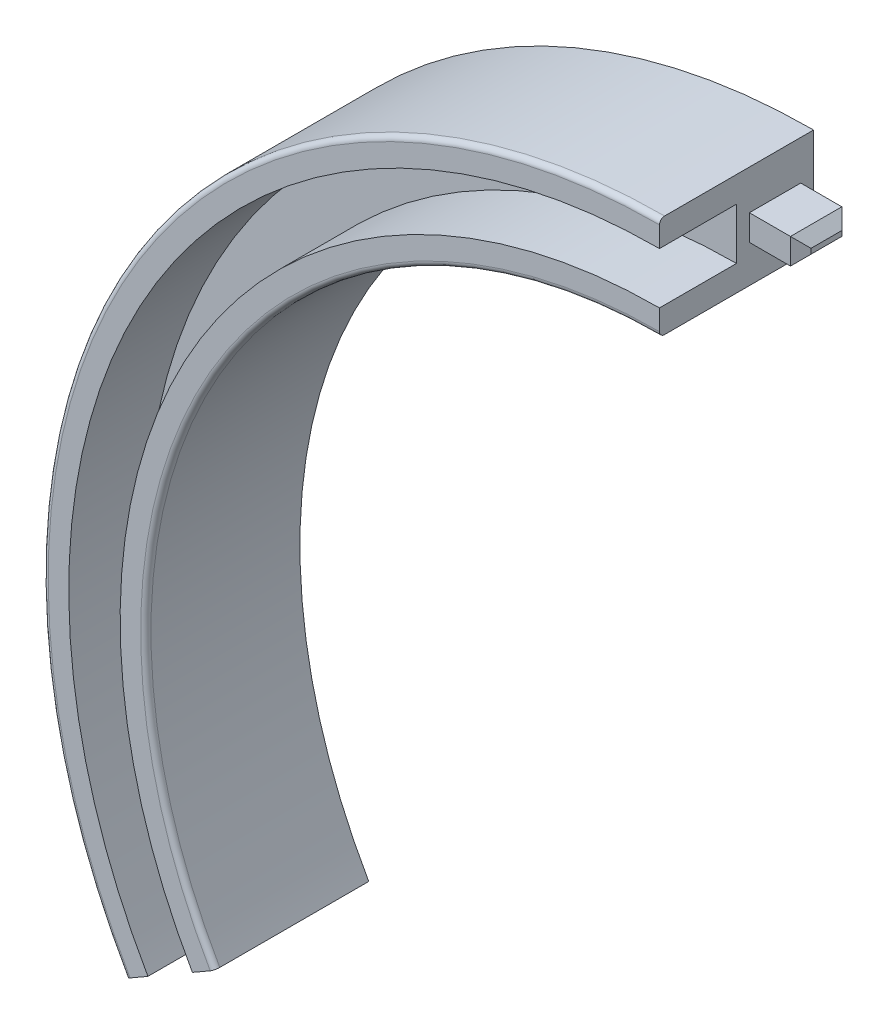
ISO-10303-21;
HEADER;
FILE_DESCRIPTION(('STEP AP214'),'2;1');
FILE_NAME('part.step','',(''),(''),'','','');
FILE_SCHEMA(('AUTOMOTIVE_DESIGN { 1 0 10303 214 1 1 1 1 }'));
ENDSEC;
DATA;
#1=APPLICATION_CONTEXT('core data for automotive mechanical design processes');
#2=APPLICATION_PROTOCOL_DEFINITION('international standard','automotive_design',2000,#1);
#3=PRODUCT_CONTEXT('',#1,'mechanical');
#4=PRODUCT('Part','Part','',(#3));
#5=PRODUCT_RELATED_PRODUCT_CATEGORY('part','',(#4));
#6=PRODUCT_DEFINITION_FORMATION('','',#4);
#7=PRODUCT_DEFINITION_CONTEXT('part definition',#1,'design');
#8=PRODUCT_DEFINITION('design','',#6,#7);
#9=PRODUCT_DEFINITION_SHAPE('','',#8);
#10=(LENGTH_UNIT() NAMED_UNIT(*) SI_UNIT(.MILLI.,.METRE.));
#11=(NAMED_UNIT(*) PLANE_ANGLE_UNIT() SI_UNIT($,.RADIAN.));
#12=(NAMED_UNIT(*) SI_UNIT($,.STERADIAN.) SOLID_ANGLE_UNIT());
#13=UNCERTAINTY_MEASURE_WITH_UNIT(LENGTH_MEASURE(1.E-05),#10,'distance_accuracy_value','');
#14=(GEOMETRIC_REPRESENTATION_CONTEXT(3) GLOBAL_UNCERTAINTY_ASSIGNED_CONTEXT((#13)) GLOBAL_UNIT_ASSIGNED_CONTEXT((#10,
#11,#12)) REPRESENTATION_CONTEXT('',''));
#15=CARTESIAN_POINT('',(0.,0.,0.));
#16=DIRECTION('',(0.,0.,1.));
#17=DIRECTION('',(1.,0.,0.));
#18=AXIS2_PLACEMENT_3D('',#15,#16,#17);
#19=CARTESIAN_POINT('',(0.,100.,30.));
#20=DIRECTION('',(-1.,0.,0.));
#21=DIRECTION('',(0.,0.,1.));
#22=AXIS2_PLACEMENT_3D('',#19,#20,#21);
#23=PLANE('',#22);
#24=DIRECTION('',(0.,0.,-1.));
#25=VECTOR('',#24,1.);
#26=CARTESIAN_POINT('',(0.,120.,30.));
#27=LINE('',#26,#25);
#28=CARTESIAN_POINT('',(0.,120.,29.));
#29=VERTEX_POINT('',#28);
#30=CARTESIAN_POINT('',(0.,120.,0.));
#31=VERTEX_POINT('',#30);
#32=EDGE_CURVE('E313',#29,#31,#27,.T.);
#33=ORIENTED_EDGE('',*,*,#32,.F.);
#34=CARTESIAN_POINT('',(0.,119.,29.));
#35=DIRECTION('',(-1.,0.,0.));
#36=DIRECTION('',(0.,0.,1.));
#37=AXIS2_PLACEMENT_3D('',#34,#35,#36);
#38=CIRCLE('',#37,1.);
#39=CARTESIAN_POINT('',(0.,119.,30.));
#40=VERTEX_POINT('',#39);
#41=EDGE_CURVE('E393',#29,#40,#38,.F.);
#42=ORIENTED_EDGE('',*,*,#41,.T.);
#43=DIRECTION('',(0.,1.,0.));
#44=VECTOR('',#43,1.);
#45=CARTESIAN_POINT('',(0.,100.,30.));
#46=LINE('',#45,#44);
#47=CARTESIAN_POINT('',(0.,115.,30.));
#48=VERTEX_POINT('',#47);
#49=EDGE_CURVE('E308',#48,#40,#46,.T.);
#50=ORIENTED_EDGE('',*,*,#49,.F.);
#51=DIRECTION('',(0.,0.,-1.));
#52=VECTOR('',#51,1.);
#53=CARTESIAN_POINT('',(0.,115.,340.50412084802));
#54=LINE('',#53,#52);
#55=CARTESIAN_POINT('',(0.,115.,15.));
#56=VERTEX_POINT('',#55);
#57=EDGE_CURVE('E296',#48,#56,#54,.T.);
#58=ORIENTED_EDGE('',*,*,#57,.T.);
#59=DIRECTION('',(0.,1.,0.));
#60=VECTOR('',#59,1.);
#61=CARTESIAN_POINT('',(0.,105.,15.));
#62=LINE('',#61,#60);
#63=CARTESIAN_POINT('',(0.,105.,15.));
#64=VERTEX_POINT('',#63);
#65=EDGE_CURVE('E277',#64,#56,#62,.T.);
#66=ORIENTED_EDGE('',*,*,#65,.F.);
#67=DIRECTION('',(0.,0.,-1.));
#68=VECTOR('',#67,1.);
#69=CARTESIAN_POINT('',(0.,105.,340.50412084802));
#70=LINE('',#69,#68);
#71=CARTESIAN_POINT('',(0.,105.,30.));
#72=VERTEX_POINT('',#71);
#73=EDGE_CURVE('E288',#72,#64,#70,.T.);
#74=ORIENTED_EDGE('',*,*,#73,.F.);
#75=CARTESIAN_POINT('',(0.,101.,30.));
#76=VERTEX_POINT('',#75);
#77=EDGE_CURVE('E310',#76,#72,#46,.T.);
#78=ORIENTED_EDGE('',*,*,#77,.F.);
#79=CARTESIAN_POINT('',(0.,101.,29.));
#80=DIRECTION('',(-1.,0.,0.));
#81=DIRECTION('',(0.,0.,1.));
#82=AXIS2_PLACEMENT_3D('',#79,#80,#81);
#83=CIRCLE('',#82,1.);
#84=CARTESIAN_POINT('',(0.,100.,29.));
#85=VERTEX_POINT('',#84);
#86=EDGE_CURVE('E61',#76,#85,#83,.F.);
#87=ORIENTED_EDGE('',*,*,#86,.T.);
#88=DIRECTION('',(0.,0.,-1.));
#89=VECTOR('',#88,1.);
#90=CARTESIAN_POINT('',(0.,100.,30.));
#91=LINE('',#90,#89);
#92=CARTESIAN_POINT('',(0.,100.,0.));
#93=VERTEX_POINT('',#92);
#94=EDGE_CURVE('E331',#85,#93,#91,.T.);
#95=ORIENTED_EDGE('',*,*,#94,.T.);
#96=DIRECTION('',(0.,1.,0.));
#97=VECTOR('',#96,1.);
#98=CARTESIAN_POINT('',(0.,100.,0.));
#99=LINE('',#98,#97);
#100=EDGE_CURVE('E325',#93,#31,#99,.T.);
#101=ORIENTED_EDGE('',*,*,#100,.T.);
#102=EDGE_LOOP('',(#33,#42,#50,#58,#66,#74,#78,#87,#95,#101));
#103=FACE_BOUND('',#102,.T.);
#104=DIRECTION('',(0.,1.,0.));
#105=VECTOR('',#104,1.);
#106=CARTESIAN_POINT('',(0.,112.298266436853,2.50000000000002));
#107=LINE('',#106,#105);
#108=CARTESIAN_POINT('',(0.,107.298266436853,2.50000000000002));
#109=VERTEX_POINT('',#108);
#110=CARTESIAN_POINT('',(0.,112.298266436853,2.50000000000002));
#111=VERTEX_POINT('',#110);
#112=EDGE_CURVE('E237',#109,#111,#107,.T.);
#113=ORIENTED_EDGE('',*,*,#112,.F.);
#114=DIRECTION('',(0.,0.,-1.));
#115=VECTOR('',#114,1.);
#116=CARTESIAN_POINT('',(0.,107.298266436853,12.5));
#117=LINE('',#116,#115);
#118=CARTESIAN_POINT('',(0.,107.298266436853,12.5));
#119=VERTEX_POINT('',#118);
#120=EDGE_CURVE('E250',#119,#109,#117,.T.);
#121=ORIENTED_EDGE('',*,*,#120,.F.);
#122=DIRECTION('',(0.,-1.,0.));
#123=VECTOR('',#122,1.);
#124=CARTESIAN_POINT('',(0.,112.298266436853,12.5));
#125=LINE('',#124,#123);
#126=CARTESIAN_POINT('',(0.,112.298266436853,12.5));
#127=VERTEX_POINT('',#126);
#128=EDGE_CURVE('E246',#127,#119,#125,.T.);
#129=ORIENTED_EDGE('',*,*,#128,.F.);
#130=DIRECTION('',(0.,0.,1.));
#131=VECTOR('',#130,1.);
#132=CARTESIAN_POINT('',(0.,112.298266436853,12.5));
#133=LINE('',#132,#131);
#134=EDGE_CURVE('E241',#111,#127,#133,.T.);
#135=ORIENTED_EDGE('',*,*,#134,.F.);
#136=EDGE_LOOP('',(#113,#121,#129,#135));
#137=FACE_BOUND('',#136,.T.);
#138=ADVANCED_FACE('F45',(#103,#137),#23,.F.);
#139=CARTESIAN_POINT('',(-86.6025403784436,-50.0000000000004,30.));
#140=DIRECTION('',(-0.500000000000004,0.866025403784436,0.));
#141=DIRECTION('',(-0.866025403784436,-0.500000000000004,0.));
#142=AXIS2_PLACEMENT_3D('',#139,#140,#141);
#143=PLANE('',#142);
#144=DIRECTION('',(-0.866025403784436,-0.500000000000004,0.));
#145=VECTOR('',#144,1.);
#146=CARTESIAN_POINT('',(-97.3859431076611,-56.2258004684943,12.5));
#147=LINE('',#146,#145);
#148=CARTESIAN_POINT('',(-93.0558160887389,-53.7258004684943,12.5));
#149=VERTEX_POINT('',#148);
#150=CARTESIAN_POINT('',(-97.3859431076611,-56.2258004684943,12.5));
#151=VERTEX_POINT('',#150);
#152=EDGE_CURVE('E222',#149,#151,#147,.T.);
#153=ORIENTED_EDGE('',*,*,#152,.F.);
#154=DIRECTION('',(0.,0.,1.));
#155=VECTOR('',#154,1.);
#156=CARTESIAN_POINT('',(-93.0558160887389,-53.7258004684943,12.5));
#157=LINE('',#156,#155);
#158=CARTESIAN_POINT('',(-93.0558160887389,-53.7258004684943,2.5));
#159=VERTEX_POINT('',#158);
#160=EDGE_CURVE('E189',#159,#149,#157,.T.);
#161=ORIENTED_EDGE('',*,*,#160,.F.);
#162=DIRECTION('',(0.866025403784436,0.500000000000004,0.));
#163=VECTOR('',#162,1.);
#164=CARTESIAN_POINT('',(-97.3859431076611,-56.2258004684943,2.5));
#165=LINE('',#164,#163);
#166=CARTESIAN_POINT('',(-97.3859431076611,-56.2258004684943,2.5));
#167=VERTEX_POINT('',#166);
#168=EDGE_CURVE('E209',#167,#159,#165,.T.);
#169=ORIENTED_EDGE('',*,*,#168,.F.);
#170=DIRECTION('',(0.,0.,-1.));
#171=VECTOR('',#170,1.);
#172=CARTESIAN_POINT('',(-97.3859431076611,-56.2258004684943,12.5));
#173=LINE('',#172,#171);
#174=EDGE_CURVE('E213',#151,#167,#173,.T.);
#175=ORIENTED_EDGE('',*,*,#174,.F.);
#176=EDGE_LOOP('',(#153,#161,#169,#175));
#177=FACE_BOUND('',#176,.T.);
#178=DIRECTION('',(0.866025403784436,0.500000000000004,0.));
#179=VECTOR('',#178,1.);
#180=CARTESIAN_POINT('',(-86.6025403784436,-50.0000000000004,30.));
#181=LINE('',#180,#179);
#182=CARTESIAN_POINT('',(-103.057023050348,-59.5000000000005,30.));
#183=VERTEX_POINT('',#182);
#184=CARTESIAN_POINT('',(-99.5929214352101,-57.5000000000005,30.));
#185=VERTEX_POINT('',#184);
#186=EDGE_CURVE('E305',#183,#185,#181,.T.);
#187=ORIENTED_EDGE('',*,*,#186,.F.);
#188=CARTESIAN_POINT('',(-103.057023050348,-59.5000000000005,29.));
#189=DIRECTION('',(-0.500000000000004,0.866025403784436,0.));
#190=DIRECTION('',(-0.866025403784436,-0.500000000000004,0.));
#191=AXIS2_PLACEMENT_3D('',#188,#189,#190);
#192=CIRCLE('',#191,1.);
#193=CARTESIAN_POINT('',(-103.923048454132,-60.0000000000005,29.));
#194=VERTEX_POINT('',#193);
#195=EDGE_CURVE('E385',#183,#194,#192,.F.);
#196=ORIENTED_EDGE('',*,*,#195,.T.);
#197=DIRECTION('',(0.,0.,-1.));
#198=VECTOR('',#197,1.);
#199=CARTESIAN_POINT('',(-103.923048454132,-60.0000000000005,30.));
#200=LINE('',#199,#198);
#201=CARTESIAN_POINT('',(-103.923048454132,-60.0000000000005,0.));
#202=VERTEX_POINT('',#201);
#203=EDGE_CURVE('E337',#194,#202,#200,.T.);
#204=ORIENTED_EDGE('',*,*,#203,.T.);
#205=DIRECTION('',(0.866025403784436,0.500000000000004,0.));
#206=VECTOR('',#205,1.);
#207=CARTESIAN_POINT('',(-86.6025403784436,-50.0000000000004,0.));
#208=LINE('',#207,#206);
#209=CARTESIAN_POINT('',(-86.6025403784436,-50.0000000000004,0.));
#210=VERTEX_POINT('',#209);
#211=EDGE_CURVE('E317',#202,#210,#208,.T.);
#212=ORIENTED_EDGE('',*,*,#211,.T.);
#213=DIRECTION('',(0.,0.,-1.));
#214=VECTOR('',#213,1.);
#215=CARTESIAN_POINT('',(-86.6025403784436,-50.0000000000004,30.));
#216=LINE('',#215,#214);
#217=CARTESIAN_POINT('',(-86.6025403784436,-50.0000000000004,29.));
#218=VERTEX_POINT('',#217);
#219=EDGE_CURVE('E334',#218,#210,#216,.T.);
#220=ORIENTED_EDGE('',*,*,#219,.F.);
#221=CARTESIAN_POINT('',(-87.4685657822281,-50.5000000000004,29.));
#222=DIRECTION('',(-0.500000000000004,0.866025403784436,0.));
#223=DIRECTION('',(-0.866025403784436,-0.500000000000004,0.));
#224=AXIS2_PLACEMENT_3D('',#221,#222,#223);
#225=CIRCLE('',#224,1.);
#226=CARTESIAN_POINT('',(-87.468565782228,-50.5000000000004,30.));
#227=VERTEX_POINT('',#226);
#228=EDGE_CURVE('E382',#218,#227,#225,.F.);
#229=ORIENTED_EDGE('',*,*,#228,.T.);
#230=CARTESIAN_POINT('',(-90.9326673973774,-52.5000000000074,30.));
#231=VERTEX_POINT('',#230);
#232=EDGE_CURVE('E309',#231,#227,#181,.T.);
#233=ORIENTED_EDGE('',*,*,#232,.F.);
#234=DIRECTION('',(0.,0.,-1.));
#235=VECTOR('',#234,1.);
#236=CARTESIAN_POINT('',(-90.9326673973658,-52.5000000000005,340.50412084802));
#237=LINE('',#236,#235);
#238=CARTESIAN_POINT('',(-90.9326673973658,-52.5000000000004,15.));
#239=VERTEX_POINT('',#238);
#240=EDGE_CURVE('E285',#231,#239,#237,.T.);
#241=ORIENTED_EDGE('',*,*,#240,.T.);
#242=DIRECTION('',(0.866025403784436,0.500000000000004,0.));
#243=VECTOR('',#242,1.);
#244=CARTESIAN_POINT('',(-86.6025403784436,-50.0000000000004,15.));
#245=LINE('',#244,#243);
#246=CARTESIAN_POINT('',(-99.5929214352101,-57.5000000000005,15.));
#247=VERTEX_POINT('',#246);
#248=EDGE_CURVE('E266',#247,#239,#245,.T.);
#249=ORIENTED_EDGE('',*,*,#248,.F.);
#250=DIRECTION('',(0.,0.,-1.));
#251=VECTOR('',#250,1.);
#252=CARTESIAN_POINT('',(-99.5929214352101,-57.5000000000005,340.50412084802));
#253=LINE('',#252,#251);
#254=EDGE_CURVE('E292',#185,#247,#253,.T.);
#255=ORIENTED_EDGE('',*,*,#254,.F.);
#256=EDGE_LOOP('',(#187,#196,#204,#212,#220,#229,#233,#241,#249,#255));
#257=FACE_BOUND('',#256,.T.);
#258=ADVANCED_FACE('F410',(#177,#257),#143,.F.);
#259=CARTESIAN_POINT('',(0.,0.,30.));
#260=DIRECTION('',(0.,0.,1.));
#261=DIRECTION('',(1.,0.,0.));
#262=AXIS2_PLACEMENT_3D('',#259,#260,#261);
#263=PLANE('',#262);
#264=ORIENTED_EDGE('',*,*,#49,.T.);
#265=CARTESIAN_POINT('',(0.,0.,30.));
#266=DIRECTION('',(0.,0.,1.));
#267=DIRECTION('',(1.,0.,0.));
#268=AXIS2_PLACEMENT_3D('',#265,#266,#267);
#269=CIRCLE('',#268,119.);
#270=EDGE_CURVE('E366',#40,#183,#269,.T.);
#271=ORIENTED_EDGE('',*,*,#270,.T.);
#272=ORIENTED_EDGE('',*,*,#186,.T.);
#273=CARTESIAN_POINT('',(0.,0.,30.));
#274=DIRECTION('',(0.,0.,1.));
#275=DIRECTION('',(1.,0.,0.));
#276=AXIS2_PLACEMENT_3D('',#273,#274,#275);
#277=CIRCLE('',#276,115.);
#278=EDGE_CURVE('E272',#48,#185,#277,.T.);
#279=ORIENTED_EDGE('',*,*,#278,.F.);
#280=EDGE_LOOP('',(#264,#271,#272,#279));
#281=FACE_BOUND('',#280,.T.);
#282=ADVANCED_FACE('F418',(#281),#263,.T.);
#283=CARTESIAN_POINT('',(0.,0.,30.));
#284=DIRECTION('',(0.,0.,-1.));
#285=DIRECTION('',(-1.,0.,0.));
#286=AXIS2_PLACEMENT_3D('',#283,#284,#285);
#287=CYLINDRICAL_SURFACE('',#286,120.);
#288=ORIENTED_EDGE('',*,*,#203,.F.);
#289=CARTESIAN_POINT('',(0.,0.,29.));
#290=DIRECTION('',(0.,0.,1.));
#291=DIRECTION('',(1.,0.,0.));
#292=AXIS2_PLACEMENT_3D('',#289,#290,#291);
#293=CIRCLE('',#292,120.);
#294=EDGE_CURVE('E388',#194,#29,#293,.F.);
#295=ORIENTED_EDGE('',*,*,#294,.T.);
#296=ORIENTED_EDGE('',*,*,#32,.T.);
#297=CARTESIAN_POINT('',(0.,0.,0.));
#298=DIRECTION('',(0.,0.,1.));
#299=DIRECTION('',(1.,0.,0.));
#300=AXIS2_PLACEMENT_3D('',#297,#298,#299);
#301=CIRCLE('',#300,120.);
#302=EDGE_CURVE('E271',#31,#202,#301,.T.);
#303=ORIENTED_EDGE('',*,*,#302,.T.);
#304=EDGE_LOOP('',(#288,#295,#296,#303));
#305=FACE_BOUND('',#304,.T.);
#306=ADVANCED_FACE('F428',(#305),#287,.T.);
#307=CARTESIAN_POINT('',(0.,0.,30.));
#308=DIRECTION('',(0.,0.,-1.));
#309=DIRECTION('',(-1.,0.,0.));
#310=AXIS2_PLACEMENT_3D('',#307,#308,#309);
#311=CYLINDRICAL_SURFACE('',#310,100.);
#312=ORIENTED_EDGE('',*,*,#94,.F.);
#313=CARTESIAN_POINT('',(0.,0.,29.));
#314=DIRECTION('',(0.,0.,1.));
#315=DIRECTION('',(1.,0.,0.));
#316=AXIS2_PLACEMENT_3D('',#313,#314,#315);
#317=CIRCLE('',#316,100.);
#318=EDGE_CURVE('E11',#85,#218,#317,.T.);
#319=ORIENTED_EDGE('',*,*,#318,.T.);
#320=ORIENTED_EDGE('',*,*,#219,.T.);
#321=CARTESIAN_POINT('',(0.,0.,0.));
#322=DIRECTION('',(0.,0.,-1.));
#323=DIRECTION('',(1.,0.,0.));
#324=AXIS2_PLACEMENT_3D('',#321,#322,#323);
#325=CIRCLE('',#324,100.);
#326=EDGE_CURVE('E321',#210,#93,#325,.T.);
#327=ORIENTED_EDGE('',*,*,#326,.T.);
#328=EDGE_LOOP('',(#312,#319,#320,#327));
#329=FACE_BOUND('',#328,.T.);
#330=ADVANCED_FACE('F435',(#329),#311,.F.);
#331=ORIENTED_EDGE('',*,*,#232,.T.);
#332=CARTESIAN_POINT('',(0.,0.,30.));
#333=DIRECTION('',(0.,0.,1.));
#334=DIRECTION('',(1.,0.,0.));
#335=AXIS2_PLACEMENT_3D('',#332,#333,#334);
#336=CIRCLE('',#335,101.);
#337=EDGE_CURVE('E54',#227,#76,#336,.F.);
#338=ORIENTED_EDGE('',*,*,#337,.T.);
#339=ORIENTED_EDGE('',*,*,#77,.T.);
#340=CARTESIAN_POINT('',(0.,0.,30.));
#341=DIRECTION('',(0.,0.,1.));
#342=DIRECTION('',(1.,0.,0.));
#343=AXIS2_PLACEMENT_3D('',#340,#341,#342);
#344=CIRCLE('',#343,105.);
#345=EDGE_CURVE('E267',#231,#72,#344,.F.);
#346=ORIENTED_EDGE('',*,*,#345,.F.);
#347=EDGE_LOOP('',(#331,#338,#339,#346));
#348=FACE_BOUND('',#347,.T.);
#349=ADVANCED_FACE('F398',(#348),#263,.T.);
#350=CARTESIAN_POINT('',(0.,0.,0.));
#351=DIRECTION('',(0.,0.,1.));
#352=DIRECTION('',(1.,0.,0.));
#353=AXIS2_PLACEMENT_3D('',#350,#351,#352);
#354=PLANE('',#353);
#355=ORIENTED_EDGE('',*,*,#302,.F.);
#356=ORIENTED_EDGE('',*,*,#100,.F.);
#357=ORIENTED_EDGE('',*,*,#326,.F.);
#358=ORIENTED_EDGE('',*,*,#211,.F.);
#359=EDGE_LOOP('',(#355,#356,#357,#358));
#360=FACE_BOUND('',#359,.T.);
#361=ADVANCED_FACE('F432',(#360),#354,.F.);
#362=CARTESIAN_POINT('',(0.,0.,340.50412084802));
#363=DIRECTION('',(0.,0.,-1.));
#364=DIRECTION('',(-1.,0.,0.));
#365=AXIS2_PLACEMENT_3D('',#362,#363,#364);
#366=CYLINDRICAL_SURFACE('',#365,115.);
#367=ORIENTED_EDGE('',*,*,#57,.F.);
#368=ORIENTED_EDGE('',*,*,#278,.T.);
#369=ORIENTED_EDGE('',*,*,#254,.T.);
#370=CARTESIAN_POINT('',(0.,0.,15.));
#371=DIRECTION('',(0.,0.,1.));
#372=DIRECTION('',(1.,0.,0.));
#373=AXIS2_PLACEMENT_3D('',#370,#371,#372);
#374=CIRCLE('',#373,115.);
#375=EDGE_CURVE('E281',#56,#247,#374,.T.);
#376=ORIENTED_EDGE('',*,*,#375,.F.);
#377=EDGE_LOOP('',(#367,#368,#369,#376));
#378=FACE_BOUND('',#377,.T.);
#379=ADVANCED_FACE('F453',(#378),#366,.F.);
#380=CARTESIAN_POINT('',(0.,0.,340.50412084802));
#381=DIRECTION('',(0.,0.,-1.));
#382=DIRECTION('',(-1.,0.,0.));
#383=AXIS2_PLACEMENT_3D('',#380,#381,#382);
#384=CYLINDRICAL_SURFACE('',#383,105.);
#385=ORIENTED_EDGE('',*,*,#240,.F.);
#386=ORIENTED_EDGE('',*,*,#345,.T.);
#387=ORIENTED_EDGE('',*,*,#73,.T.);
#388=CARTESIAN_POINT('',(0.,0.,15.));
#389=DIRECTION('',(0.,0.,1.));
#390=DIRECTION('',(1.,0.,0.));
#391=AXIS2_PLACEMENT_3D('',#388,#389,#390);
#392=CIRCLE('',#391,105.);
#393=EDGE_CURVE('E273',#239,#64,#392,.F.);
#394=ORIENTED_EDGE('',*,*,#393,.F.);
#395=EDGE_LOOP('',(#385,#386,#387,#394));
#396=FACE_BOUND('',#395,.T.);
#397=ADVANCED_FACE('F407',(#396),#384,.T.);
#398=CARTESIAN_POINT('',(0.,0.,15.));
#399=DIRECTION('',(0.,0.,1.));
#400=DIRECTION('',(1.,0.,0.));
#401=AXIS2_PLACEMENT_3D('',#398,#399,#400);
#402=PLANE('',#401);
#403=ORIENTED_EDGE('',*,*,#393,.T.);
#404=ORIENTED_EDGE('',*,*,#65,.T.);
#405=ORIENTED_EDGE('',*,*,#375,.T.);
#406=ORIENTED_EDGE('',*,*,#248,.T.);
#407=EDGE_LOOP('',(#403,#404,#405,#406));
#408=FACE_BOUND('',#407,.T.);
#409=ADVANCED_FACE('F455',(#408),#402,.T.);
#410=CARTESIAN_POINT('',(10.,112.298266436853,2.50000000000002));
#411=DIRECTION('',(0.,0.,1.));
#412=DIRECTION('',(0.,-1.,0.));
#413=AXIS2_PLACEMENT_3D('',#410,#411,#412);
#414=PLANE('',#413);
#415=DIRECTION('',(-1.,0.,0.));
#416=VECTOR('',#415,1.);
#417=CARTESIAN_POINT('',(10.,112.298266436853,2.50000000000002));
#418=LINE('',#417,#416);
#419=CARTESIAN_POINT('',(8.00000000000003,112.298266436853,2.50000000000002));
#420=VERTEX_POINT('',#419);
#421=EDGE_CURVE('E263',#420,#111,#418,.T.);
#422=ORIENTED_EDGE('',*,*,#421,.F.);
#423=DIRECTION('',(0.,-1.,0.));
#424=VECTOR('',#423,1.);
#425=CARTESIAN_POINT('',(8.00000000000003,107.298266436853,2.50000000000002));
#426=LINE('',#425,#424);
#427=CARTESIAN_POINT('',(8.00000000000003,107.298266436853,2.50000000000002));
#428=VERTEX_POINT('',#427);
#429=EDGE_CURVE('E363',#420,#428,#426,.T.);
#430=ORIENTED_EDGE('',*,*,#429,.T.);
#431=DIRECTION('',(-1.,0.,0.));
#432=VECTOR('',#431,1.);
#433=CARTESIAN_POINT('',(10.,107.298266436853,2.50000000000002));
#434=LINE('',#433,#432);
#435=EDGE_CURVE('E254',#428,#109,#434,.T.);
#436=ORIENTED_EDGE('',*,*,#435,.T.);
#437=ORIENTED_EDGE('',*,*,#112,.T.);
#438=EDGE_LOOP('',(#422,#430,#436,#437));
#439=FACE_BOUND('',#438,.T.);
#440=ADVANCED_FACE('F458',(#439),#414,.F.);
#441=CARTESIAN_POINT('',(10.,112.298266436853,12.5));
#442=DIRECTION('',(0.,-1.,0.));
#443=DIRECTION('',(0.,0.,-1.));
#444=AXIS2_PLACEMENT_3D('',#441,#442,#443);
#445=PLANE('',#444);
#446=DIRECTION('',(-1.,0.,0.));
#447=VECTOR('',#446,1.);
#448=CARTESIAN_POINT('',(10.,112.298266436853,12.5));
#449=LINE('',#448,#447);
#450=CARTESIAN_POINT('',(8.00000000000003,112.298266436853,12.5));
#451=VERTEX_POINT('',#450);
#452=EDGE_CURVE('E260',#451,#127,#449,.T.);
#453=ORIENTED_EDGE('',*,*,#452,.F.);
#454=DIRECTION('',(0.,0.,-1.));
#455=VECTOR('',#454,1.);
#456=CARTESIAN_POINT('',(8.00000000000003,112.298266436853,2.50000000000002));
#457=LINE('',#456,#455);
#458=EDGE_CURVE('E360',#451,#420,#457,.T.);
#459=ORIENTED_EDGE('',*,*,#458,.T.);
#460=ORIENTED_EDGE('',*,*,#421,.T.);
#461=ORIENTED_EDGE('',*,*,#134,.T.);
#462=EDGE_LOOP('',(#453,#459,#460,#461));
#463=FACE_BOUND('',#462,.T.);
#464=ADVANCED_FACE('F467',(#463),#445,.F.);
#465=CARTESIAN_POINT('',(10.,112.298266436853,12.5));
#466=DIRECTION('',(0.,0.,-1.));
#467=DIRECTION('',(-1.,0.,0.));
#468=AXIS2_PLACEMENT_3D('',#465,#466,#467);
#469=PLANE('',#468);
#470=DIRECTION('',(-1.,0.,0.));
#471=VECTOR('',#470,1.);
#472=CARTESIAN_POINT('',(10.,107.298266436853,12.5));
#473=LINE('',#472,#471);
#474=CARTESIAN_POINT('',(8.00000000000003,107.298266436853,12.5));
#475=VERTEX_POINT('',#474);
#476=EDGE_CURVE('E257',#475,#119,#473,.T.);
#477=ORIENTED_EDGE('',*,*,#476,.F.);
#478=DIRECTION('',(0.,1.,0.));
#479=VECTOR('',#478,1.);
#480=CARTESIAN_POINT('',(8.00000000000003,112.298266436853,12.5));
#481=LINE('',#480,#479);
#482=EDGE_CURVE('E357',#475,#451,#481,.T.);
#483=ORIENTED_EDGE('',*,*,#482,.T.);
#484=ORIENTED_EDGE('',*,*,#452,.T.);
#485=ORIENTED_EDGE('',*,*,#128,.T.);
#486=EDGE_LOOP('',(#477,#483,#484,#485));
#487=FACE_BOUND('',#486,.T.);
#488=ADVANCED_FACE('F471',(#487),#469,.F.);
#489=CARTESIAN_POINT('',(10.,107.298266436853,12.5));
#490=DIRECTION('',(0.,1.,0.));
#491=DIRECTION('',(0.,0.,1.));
#492=AXIS2_PLACEMENT_3D('',#489,#490,#491);
#493=PLANE('',#492);
#494=ORIENTED_EDGE('',*,*,#435,.F.);
#495=DIRECTION('',(0.,0.,1.));
#496=VECTOR('',#495,1.);
#497=CARTESIAN_POINT('',(8.00000000000003,107.298266436853,12.5));
#498=LINE('',#497,#496);
#499=EDGE_CURVE('E353',#428,#475,#498,.T.);
#500=ORIENTED_EDGE('',*,*,#499,.T.);
#501=ORIENTED_EDGE('',*,*,#476,.T.);
#502=ORIENTED_EDGE('',*,*,#120,.T.);
#503=EDGE_LOOP('',(#494,#500,#501,#502));
#504=FACE_BOUND('',#503,.T.);
#505=ADVANCED_FACE('F475',(#504),#493,.F.);
#506=CARTESIAN_POINT('',(10.,0.,0.));
#507=DIRECTION('',(1.,0.,0.));
#508=DIRECTION('',(0.,0.,-1.));
#509=AXIS2_PLACEMENT_3D('',#506,#507,#508);
#510=PLANE('',#509);
#511=DIRECTION('',(0.,-1.,0.));
#512=VECTOR('',#511,1.);
#513=CARTESIAN_POINT('',(10.,107.298266436853,10.5));
#514=LINE('',#513,#512);
#515=CARTESIAN_POINT('',(10.,110.298266436853,10.5));
#516=VERTEX_POINT('',#515);
#517=CARTESIAN_POINT('',(10.,109.298266436853,10.5));
#518=VERTEX_POINT('',#517);
#519=EDGE_CURVE('E346',#516,#518,#514,.T.);
#520=ORIENTED_EDGE('',*,*,#519,.T.);
#521=DIRECTION('',(0.,0.,-1.));
#522=VECTOR('',#521,1.);
#523=CARTESIAN_POINT('',(10.,109.298266436853,2.50000000000002));
#524=LINE('',#523,#522);
#525=CARTESIAN_POINT('',(10.,109.298266436853,4.49999999999999));
#526=VERTEX_POINT('',#525);
#527=EDGE_CURVE('E349',#518,#526,#524,.T.);
#528=ORIENTED_EDGE('',*,*,#527,.T.);
#529=DIRECTION('',(0.,1.,0.));
#530=VECTOR('',#529,1.);
#531=CARTESIAN_POINT('',(10.,112.298266436853,4.49999999999999));
#532=LINE('',#531,#530);
#533=CARTESIAN_POINT('',(10.,110.298266436853,4.49999999999999));
#534=VERTEX_POINT('',#533);
#535=EDGE_CURVE('E340',#526,#534,#532,.T.);
#536=ORIENTED_EDGE('',*,*,#535,.T.);
#537=DIRECTION('',(0.,0.,1.));
#538=VECTOR('',#537,1.);
#539=CARTESIAN_POINT('',(10.,110.298266436853,12.5));
#540=LINE('',#539,#538);
#541=EDGE_CURVE('E343',#534,#516,#540,.T.);
#542=ORIENTED_EDGE('',*,*,#541,.T.);
#543=EDGE_LOOP('',(#520,#528,#536,#542));
#544=FACE_BOUND('',#543,.T.);
#545=ADVANCED_FACE('F479',(#544),#510,.T.);
#546=CARTESIAN_POINT('',(10.,110.298266436853,0.));
#547=DIRECTION('',(0.707106781186547,0.707106781186547,0.));
#548=DIRECTION('',(0.,0.,-1.));
#549=AXIS2_PLACEMENT_3D('',#546,#547,#548);
#550=PLANE('',#549);
#551=DIRECTION('',(0.577350269189626,-0.577350269189626,0.577350269189626));
#552=VECTOR('',#551,1.);
#553=CARTESIAN_POINT('',(46.7660888122844,73.5321776245688,41.2660888122843));
#554=LINE('',#553,#552);
#555=EDGE_CURVE('E372',#420,#534,#554,.T.);
#556=ORIENTED_EDGE('',*,*,#555,.F.);
#557=ORIENTED_EDGE('',*,*,#458,.F.);
#558=DIRECTION('',(0.577350269189626,-0.577350269189626,-0.577350269189626));
#559=VECTOR('',#558,1.);
#560=CARTESIAN_POINT('',(13.5,106.798266436853,7.00000000000003));
#561=LINE('',#560,#559);
#562=EDGE_CURVE('E242',#516,#451,#561,.F.);
#563=ORIENTED_EDGE('',*,*,#562,.F.);
#564=ORIENTED_EDGE('',*,*,#541,.F.);
#565=EDGE_LOOP('',(#556,#557,#563,#564));
#566=FACE_BOUND('',#565,.T.);
#567=ADVANCED_FACE('F483',(#566),#550,.T.);
#568=CARTESIAN_POINT('',(10.,0.,10.5));
#569=DIRECTION('',(0.707106781186547,0.,0.707106781186547));
#570=DIRECTION('',(0.,1.,0.));
#571=AXIS2_PLACEMENT_3D('',#568,#569,#570);
#572=PLANE('',#571);
#573=ORIENTED_EDGE('',*,*,#562,.T.);
#574=ORIENTED_EDGE('',*,*,#482,.F.);
#575=DIRECTION('',(0.577350269189626,0.577350269189626,-0.577350269189626));
#576=VECTOR('',#575,1.);
#577=CARTESIAN_POINT('',(-26.432755478951,72.865510957902,46.9327554789511));
#578=LINE('',#577,#576);
#579=EDGE_CURVE('E369',#518,#475,#578,.F.);
#580=ORIENTED_EDGE('',*,*,#579,.F.);
#581=ORIENTED_EDGE('',*,*,#519,.F.);
#582=EDGE_LOOP('',(#573,#574,#580,#581));
#583=FACE_BOUND('',#582,.T.);
#584=ADVANCED_FACE('F512',(#583),#572,.T.);
#585=CARTESIAN_POINT('',(10.,0.,4.49999999999995));
#586=DIRECTION('',(0.707106781186547,0.,-0.707106781186547));
#587=DIRECTION('',(0.,-1.,0.));
#588=AXIS2_PLACEMENT_3D('',#585,#586,#587);
#589=PLANE('',#588);
#590=ORIENTED_EDGE('',*,*,#555,.T.);
#591=ORIENTED_EDGE('',*,*,#535,.F.);
#592=DIRECTION('',(-0.577350269189626,-0.577350269189626,-0.577350269189626));
#593=VECTOR('',#592,1.);
#594=CARTESIAN_POINT('',(-26.432755478951,72.865510957902,-31.932755478951));
#595=LINE('',#594,#593);
#596=EDGE_CURVE('E231',#428,#526,#595,.F.);
#597=ORIENTED_EDGE('',*,*,#596,.F.);
#598=ORIENTED_EDGE('',*,*,#429,.F.);
#599=EDGE_LOOP('',(#590,#591,#597,#598));
#600=FACE_BOUND('',#599,.T.);
#601=ADVANCED_FACE('F519',(#600),#589,.T.);
#602=CARTESIAN_POINT('',(10.,109.298266436853,0.));
#603=DIRECTION('',(0.707106781186547,-0.707106781186547,0.));
#604=DIRECTION('',(0.,0.,1.));
#605=AXIS2_PLACEMENT_3D('',#602,#603,#604);
#606=PLANE('',#605);
#607=ORIENTED_EDGE('',*,*,#579,.T.);
#608=ORIENTED_EDGE('',*,*,#499,.F.);
#609=ORIENTED_EDGE('',*,*,#596,.T.);
#610=ORIENTED_EDGE('',*,*,#527,.F.);
#611=EDGE_LOOP('',(#607,#608,#609,#610));
#612=FACE_BOUND('',#611,.T.);
#613=ADVANCED_FACE('F488',(#612),#606,.T.);
#614=CARTESIAN_POINT('',(-98.0558160887389,-45.0655464306499,12.5));
#615=DIRECTION('',(0.866025403784436,0.500000000000004,0.));
#616=DIRECTION('',(-0.500000000000004,0.866025403784436,0.));
#617=AXIS2_PLACEMENT_3D('',#614,#615,#616);
#618=PLANE('',#617);
#619=ORIENTED_EDGE('',*,*,#160,.T.);
#620=DIRECTION('',(0.500000000000004,-0.866025403784436,0.));
#621=VECTOR('',#620,1.);
#622=CARTESIAN_POINT('',(-98.0558160887389,-45.0655464306499,12.5));
#623=LINE('',#622,#621);
#624=CARTESIAN_POINT('',(-98.0558160887389,-45.0655464306499,12.5));
#625=VERTEX_POINT('',#624);
#626=EDGE_CURVE('E182',#625,#149,#623,.T.);
#627=ORIENTED_EDGE('',*,*,#626,.F.);
#628=DIRECTION('',(0.,0.,1.));
#629=VECTOR('',#628,1.);
#630=CARTESIAN_POINT('',(-98.0558160887389,-45.0655464306499,12.5));
#631=LINE('',#630,#629);
#632=CARTESIAN_POINT('',(-98.0558160887389,-45.0655464306499,2.5));
#633=VERTEX_POINT('',#632);
#634=EDGE_CURVE('E186',#633,#625,#631,.T.);
#635=ORIENTED_EDGE('',*,*,#634,.F.);
#636=DIRECTION('',(0.500000000000004,-0.866025403784436,0.));
#637=VECTOR('',#636,1.);
#638=CARTESIAN_POINT('',(-98.0558160887389,-45.0655464306499,2.5));
#639=LINE('',#638,#637);
#640=EDGE_CURVE('E228',#633,#159,#639,.T.);
#641=ORIENTED_EDGE('',*,*,#640,.T.);
#642=EDGE_LOOP('',(#619,#627,#635,#641));
#643=FACE_BOUND('',#642,.T.);
#644=ADVANCED_FACE('F184',(#643),#618,.F.);
#645=CARTESIAN_POINT('',(-102.385943107661,-47.56554643065,2.5));
#646=DIRECTION('',(0.,0.,-1.));
#647=DIRECTION('',(-1.,0.,0.));
#648=AXIS2_PLACEMENT_3D('',#645,#646,#647);
#649=PLANE('',#648);
#650=ORIENTED_EDGE('',*,*,#168,.T.);
#651=ORIENTED_EDGE('',*,*,#640,.F.);
#652=DIRECTION('',(0.866025403784436,0.500000000000004,0.));
#653=VECTOR('',#652,1.);
#654=CARTESIAN_POINT('',(-102.385943107661,-47.56554643065,2.5));
#655=LINE('',#654,#653);
#656=CARTESIAN_POINT('',(-102.385943107661,-47.56554643065,2.5));
#657=VERTEX_POINT('',#656);
#658=EDGE_CURVE('E195',#657,#633,#655,.T.);
#659=ORIENTED_EDGE('',*,*,#658,.F.);
#660=DIRECTION('',(0.500000000000004,-0.866025403784436,0.));
#661=VECTOR('',#660,1.);
#662=CARTESIAN_POINT('',(-102.385943107661,-47.56554643065,2.5));
#663=LINE('',#662,#661);
#664=EDGE_CURVE('E232',#657,#167,#663,.T.);
#665=ORIENTED_EDGE('',*,*,#664,.T.);
#666=EDGE_LOOP('',(#650,#651,#659,#665));
#667=FACE_BOUND('',#666,.T.);
#668=ADVANCED_FACE('F487',(#667),#649,.F.);
#669=CARTESIAN_POINT('',(-102.385943107661,-47.56554643065,12.5));
#670=DIRECTION('',(-0.866025403784436,-0.500000000000004,0.));
#671=DIRECTION('',(0.500000000000004,-0.866025403784436,0.));
#672=AXIS2_PLACEMENT_3D('',#669,#670,#671);
#673=PLANE('',#672);
#674=ORIENTED_EDGE('',*,*,#174,.T.);
#675=ORIENTED_EDGE('',*,*,#664,.F.);
#676=DIRECTION('',(0.,0.,-1.));
#677=VECTOR('',#676,1.);
#678=CARTESIAN_POINT('',(-102.385943107661,-47.56554643065,12.5));
#679=LINE('',#678,#677);
#680=CARTESIAN_POINT('',(-102.385943107661,-47.56554643065,12.5));
#681=VERTEX_POINT('',#680);
#682=EDGE_CURVE('E204',#681,#657,#679,.T.);
#683=ORIENTED_EDGE('',*,*,#682,.F.);
#684=DIRECTION('',(0.500000000000004,-0.866025403784436,0.));
#685=VECTOR('',#684,1.);
#686=CARTESIAN_POINT('',(-102.385943107661,-47.56554643065,12.5));
#687=LINE('',#686,#685);
#688=EDGE_CURVE('E194',#681,#151,#687,.T.);
#689=ORIENTED_EDGE('',*,*,#688,.T.);
#690=EDGE_LOOP('',(#674,#675,#683,#689));
#691=FACE_BOUND('',#690,.T.);
#692=ADVANCED_FACE('F491',(#691),#673,.F.);
#693=CARTESIAN_POINT('',(-102.385943107661,-47.56554643065,12.5));
#694=DIRECTION('',(0.,0.,1.));
#695=DIRECTION('',(1.,0.,0.));
#696=AXIS2_PLACEMENT_3D('',#693,#694,#695);
#697=PLANE('',#696);
#698=ORIENTED_EDGE('',*,*,#152,.T.);
#699=ORIENTED_EDGE('',*,*,#688,.F.);
#700=DIRECTION('',(-0.866025403784436,-0.500000000000004,0.));
#701=VECTOR('',#700,1.);
#702=CARTESIAN_POINT('',(-102.385943107661,-47.56554643065,12.5));
#703=LINE('',#702,#701);
#704=EDGE_CURVE('E198',#625,#681,#703,.T.);
#705=ORIENTED_EDGE('',*,*,#704,.F.);
#706=ORIENTED_EDGE('',*,*,#626,.T.);
#707=EDGE_LOOP('',(#698,#699,#705,#706));
#708=FACE_BOUND('',#707,.T.);
#709=ADVANCED_FACE('F199',(#708),#697,.F.);
#710=CARTESIAN_POINT('',(-5.00000000000003,8.66025403784435,0.));
#711=DIRECTION('',(0.500000000000004,-0.866025403784436,0.));
#712=DIRECTION('',(0.866025403784436,0.500000000000004,0.));
#713=AXIS2_PLACEMENT_3D('',#710,#711,#712);
#714=PLANE('',#713);
#715=ORIENTED_EDGE('',*,*,#634,.T.);
#716=ORIENTED_EDGE('',*,*,#704,.T.);
#717=ORIENTED_EDGE('',*,*,#682,.T.);
#718=ORIENTED_EDGE('',*,*,#658,.T.);
#719=EDGE_LOOP('',(#715,#716,#717,#718));
#720=FACE_BOUND('',#719,.T.);
#721=ADVANCED_FACE('F206',(#720),#714,.T.);
#722=CARTESIAN_POINT('',(0.,0.,29.));
#723=DIRECTION('',(0.,0.,1.));
#724=DIRECTION('',(1.,0.,0.));
#725=AXIS2_PLACEMENT_3D('',#722,#723,#724);
#726=TOROIDAL_SURFACE('',#725,119.,1.);
#727=ORIENTED_EDGE('',*,*,#41,.F.);
#728=ORIENTED_EDGE('',*,*,#294,.F.);
#729=ORIENTED_EDGE('',*,*,#195,.F.);
#730=ORIENTED_EDGE('',*,*,#270,.F.);
#731=EDGE_LOOP('',(#727,#728,#729,#730));
#732=FACE_BOUND('',#731,.T.);
#733=ADVANCED_FACE('F422',(#732),#726,.T.);
#734=CARTESIAN_POINT('',(0.,0.,29.));
#735=DIRECTION('',(0.,0.,1.));
#736=DIRECTION('',(1.,0.,0.));
#737=AXIS2_PLACEMENT_3D('',#734,#735,#736);
#738=TOROIDAL_SURFACE('',#737,101.,1.);
#739=ORIENTED_EDGE('',*,*,#228,.F.);
#740=ORIENTED_EDGE('',*,*,#318,.F.);
#741=ORIENTED_EDGE('',*,*,#86,.F.);
#742=ORIENTED_EDGE('',*,*,#337,.F.);
#743=EDGE_LOOP('',(#739,#740,#741,#742));
#744=FACE_BOUND('',#743,.T.);
#745=ADVANCED_FACE('F47',(#744),#738,.T.);
#746=CLOSED_SHELL('',(#138,#258,#282,#306,#330,#349,#361,#379,#397,#409,#440,#464,#488,#505,
#545,#567,#584,#601,#613,#644,#668,#692,#709,#721,#733,#745));
#747=MANIFOLD_SOLID_BREP('B2',#746);
#748=ADVANCED_BREP_SHAPE_REPRESENTATION('',(#18,#747),#14);
#749=SHAPE_DEFINITION_REPRESENTATION(#9,#748);
ENDSEC;
END-ISO-10303-21;
